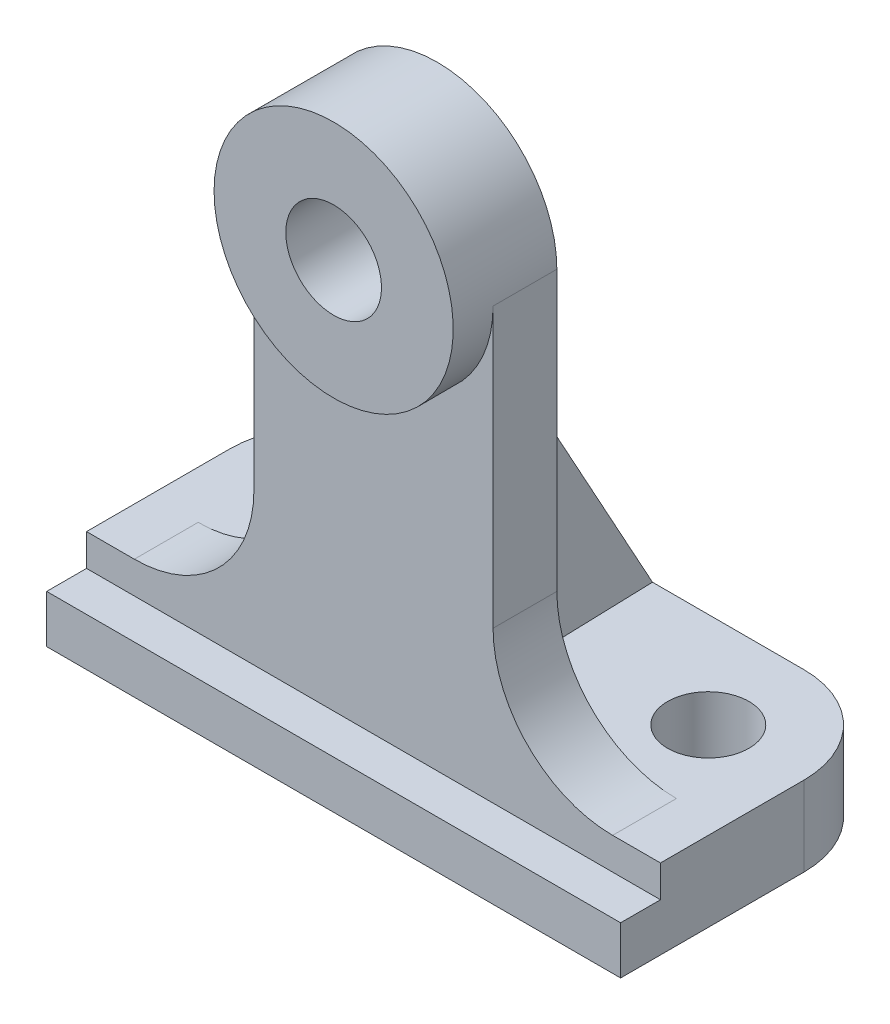
ISO-10303-21;
HEADER;
FILE_DESCRIPTION(('STEP AP214'),'2;1');
FILE_NAME('part.step','',(''),(''),'','','');
FILE_SCHEMA(('AUTOMOTIVE_DESIGN { 1 0 10303 214 1 1 1 1 }'));
ENDSEC;
DATA;
#1=APPLICATION_CONTEXT('core data for automotive mechanical design processes');
#2=APPLICATION_PROTOCOL_DEFINITION('international standard','automotive_design',2000,#1);
#3=PRODUCT_CONTEXT('',#1,'mechanical');
#4=PRODUCT('Part','Part','',(#3));
#5=PRODUCT_RELATED_PRODUCT_CATEGORY('part','',(#4));
#6=PRODUCT_DEFINITION_FORMATION('','',#4);
#7=PRODUCT_DEFINITION_CONTEXT('part definition',#1,'design');
#8=PRODUCT_DEFINITION('design','',#6,#7);
#9=PRODUCT_DEFINITION_SHAPE('','',#8);
#10=(LENGTH_UNIT() NAMED_UNIT(*) SI_UNIT(.MILLI.,.METRE.));
#11=(NAMED_UNIT(*) PLANE_ANGLE_UNIT() SI_UNIT($,.RADIAN.));
#12=(NAMED_UNIT(*) SI_UNIT($,.STERADIAN.) SOLID_ANGLE_UNIT());
#13=UNCERTAINTY_MEASURE_WITH_UNIT(LENGTH_MEASURE(1.E-05),#10,'distance_accuracy_value','');
#14=(GEOMETRIC_REPRESENTATION_CONTEXT(3) GLOBAL_UNCERTAINTY_ASSIGNED_CONTEXT((#13)) GLOBAL_UNIT_ASSIGNED_CONTEXT((#10,
#11,#12)) REPRESENTATION_CONTEXT('',''));
#15=CARTESIAN_POINT('',(0.,0.,0.));
#16=DIRECTION('',(0.,0.,1.));
#17=DIRECTION('',(1.,0.,0.));
#18=AXIS2_PLACEMENT_3D('',#15,#16,#17);
#19=CARTESIAN_POINT('',(-36.,5.,35.));
#20=DIRECTION('',(0.,-1.,0.));
#21=DIRECTION('',(0.,0.,-1.));
#22=AXIS2_PLACEMENT_3D('',#19,#20,#21);
#23=PLANE('',#22);
#24=CARTESIAN_POINT('',(-24.,5.,12.));
#25=DIRECTION('',(0.,1.,0.));
#26=DIRECTION('',(0.,0.,1.));
#27=AXIS2_PLACEMENT_3D('',#24,#25,#26);
#28=CIRCLE('',#27,5.1);
#29=CARTESIAN_POINT('',(-24.,5.,17.1));
#30=VERTEX_POINT('',#29);
#31=EDGE_CURVE('E366',#30,#30,#28,.T.);
#32=ORIENTED_EDGE('',*,*,#31,.F.);
#33=EDGE_LOOP('',(#32));
#34=FACE_BOUND('',#33,.T.);
#35=DIRECTION('',(-1.,0.,0.));
#36=VECTOR('',#35,1.);
#37=CARTESIAN_POINT('',(-36.,5.,0.));
#38=LINE('',#37,#36);
#39=CARTESIAN_POINT('',(-5.,5.,0.));
#40=VERTEX_POINT('',#39);
#41=CARTESIAN_POINT('',(-24.,5.,0.));
#42=VERTEX_POINT('',#41);
#43=EDGE_CURVE('E180',#40,#42,#38,.T.);
#44=ORIENTED_EDGE('',*,*,#43,.T.);
#45=CARTESIAN_POINT('',(-24.,5.,12.));
#46=DIRECTION('',(0.,-1.,0.));
#47=DIRECTION('',(0.,0.,-1.));
#48=AXIS2_PLACEMENT_3D('',#45,#46,#47);
#49=CIRCLE('',#48,12.);
#50=CARTESIAN_POINT('',(-36.,5.,12.));
#51=VERTEX_POINT('',#50);
#52=EDGE_CURVE('E242',#42,#51,#49,.F.);
#53=ORIENTED_EDGE('',*,*,#52,.T.);
#54=DIRECTION('',(0.,0.,-1.));
#55=VECTOR('',#54,1.);
#56=CARTESIAN_POINT('',(-36.,5.,35.));
#57=LINE('',#56,#55);
#58=CARTESIAN_POINT('',(-36.,5.,30.));
#59=VERTEX_POINT('',#58);
#60=EDGE_CURVE('E209',#59,#51,#57,.T.);
#61=ORIENTED_EDGE('',*,*,#60,.F.);
#62=DIRECTION('',(-1.,0.,0.));
#63=VECTOR('',#62,1.);
#64=CARTESIAN_POINT('',(36.,5.,30.));
#65=LINE('',#64,#63);
#66=CARTESIAN_POINT('',(-30.,5.,30.));
#67=VERTEX_POINT('',#66);
#68=EDGE_CURVE('E257',#67,#59,#65,.T.);
#69=ORIENTED_EDGE('',*,*,#68,.F.);
#70=DIRECTION('',(0.,0.,-1.));
#71=VECTOR('',#70,1.);
#72=CARTESIAN_POINT('',(-30.,5.,35.));
#73=LINE('',#72,#71);
#74=CARTESIAN_POINT('',(-30.,5.,22.));
#75=VERTEX_POINT('',#74);
#76=EDGE_CURVE('E217',#67,#75,#73,.T.);
#77=ORIENTED_EDGE('',*,*,#76,.T.);
#78=DIRECTION('',(1.,0.,0.));
#79=VECTOR('',#78,1.);
#80=CARTESIAN_POINT('',(-15.,5.,22.));
#81=LINE('',#80,#79);
#82=CARTESIAN_POINT('',(-5.67315894298179,5.,22.));
#83=VERTEX_POINT('',#82);
#84=EDGE_CURVE('E183',#75,#83,#81,.T.);
#85=ORIENTED_EDGE('',*,*,#84,.T.);
#86=DIRECTION('',(-0.0305838201349596,0.,0.999532205557156));
#87=VECTOR('',#86,1.);
#88=CARTESIAN_POINT('',(-6.09892943346056,5.,35.914916957118));
#89=LINE('',#88,#87);
#90=EDGE_CURVE('E172',#40,#83,#89,.T.);
#91=ORIENTED_EDGE('',*,*,#90,.F.);
#92=EDGE_LOOP('',(#44,#53,#61,#69,#77,#85,#91));
#93=FACE_BOUND('',#92,.T.);
#94=ADVANCED_FACE('F39',(#34,#93),#23,.F.);
#95=CARTESIAN_POINT('',(24.,5.,12.));
#96=DIRECTION('',(0.,1.,0.));
#97=DIRECTION('',(0.,0.,1.));
#98=AXIS2_PLACEMENT_3D('',#95,#96,#97);
#99=CIRCLE('',#98,5.1);
#100=CARTESIAN_POINT('',(24.,5.,17.1));
#101=VERTEX_POINT('',#100);
#102=EDGE_CURVE('E360',#101,#101,#99,.T.);
#103=ORIENTED_EDGE('',*,*,#102,.F.);
#104=EDGE_LOOP('',(#103));
#105=FACE_BOUND('',#104,.T.);
#106=DIRECTION('',(0.,0.,-1.));
#107=VECTOR('',#106,1.);
#108=CARTESIAN_POINT('',(36.,5.,35.));
#109=LINE('',#108,#107);
#110=CARTESIAN_POINT('',(36.,5.,30.));
#111=VERTEX_POINT('',#110);
#112=CARTESIAN_POINT('',(36.,5.,12.));
#113=VERTEX_POINT('',#112);
#114=EDGE_CURVE('E212',#111,#113,#109,.T.);
#115=ORIENTED_EDGE('',*,*,#114,.T.);
#116=CARTESIAN_POINT('',(24.,5.,12.));
#117=DIRECTION('',(0.,-1.,0.));
#118=DIRECTION('',(0.,0.,-1.));
#119=AXIS2_PLACEMENT_3D('',#116,#117,#118);
#120=CIRCLE('',#119,12.);
#121=CARTESIAN_POINT('',(24.,5.,0.));
#122=VERTEX_POINT('',#121);
#123=EDGE_CURVE('E12',#113,#122,#120,.F.);
#124=ORIENTED_EDGE('',*,*,#123,.T.);
#125=CARTESIAN_POINT('',(5.,4.99999999999999,0.));
#126=VERTEX_POINT('',#125);
#127=EDGE_CURVE('E189',#122,#126,#38,.T.);
#128=ORIENTED_EDGE('',*,*,#127,.T.);
#129=DIRECTION('',(0.0305838201349596,0.,0.999532205557156));
#130=VECTOR('',#129,1.);
#131=CARTESIAN_POINT('',(6.03158278956913,5.,33.7139120071601));
#132=LINE('',#131,#130);
#133=CARTESIAN_POINT('',(5.67315894298178,5.,22.));
#134=VERTEX_POINT('',#133);
#135=EDGE_CURVE('E355',#126,#134,#132,.T.);
#136=ORIENTED_EDGE('',*,*,#135,.T.);
#137=CARTESIAN_POINT('',(30.,5.,22.));
#138=VERTEX_POINT('',#137);
#139=EDGE_CURVE('E330',#134,#138,#81,.T.);
#140=ORIENTED_EDGE('',*,*,#139,.T.);
#141=DIRECTION('',(0.,0.,1.));
#142=VECTOR('',#141,1.);
#143=CARTESIAN_POINT('',(30.,5.,35.));
#144=LINE('',#143,#142);
#145=CARTESIAN_POINT('',(30.,5.,30.));
#146=VERTEX_POINT('',#145);
#147=EDGE_CURVE('E214',#138,#146,#144,.T.);
#148=ORIENTED_EDGE('',*,*,#147,.T.);
#149=EDGE_CURVE('E253',#111,#146,#65,.T.);
#150=ORIENTED_EDGE('',*,*,#149,.F.);
#151=EDGE_LOOP('',(#115,#124,#128,#136,#140,#148,#150));
#152=FACE_BOUND('',#151,.T.);
#153=ADVANCED_FACE('F251',(#105,#152),#23,.F.);
#154=CARTESIAN_POINT('',(36.,5.,35.));
#155=DIRECTION('',(-1.,0.,0.));
#156=DIRECTION('',(0.,0.,1.));
#157=AXIS2_PLACEMENT_3D('',#154,#155,#156);
#158=PLANE('',#157);
#159=DIRECTION('',(0.,0.,-1.));
#160=VECTOR('',#159,1.);
#161=CARTESIAN_POINT('',(36.,-5.,35.));
#162=LINE('',#161,#160);
#163=CARTESIAN_POINT('',(36.,-5.,35.));
#164=VERTEX_POINT('',#163);
#165=CARTESIAN_POINT('',(36.,-5.,12.));
#166=VERTEX_POINT('',#165);
#167=EDGE_CURVE('E203',#164,#166,#162,.T.);
#168=ORIENTED_EDGE('',*,*,#167,.T.);
#169=DIRECTION('',(0.,1.,0.));
#170=VECTOR('',#169,1.);
#171=CARTESIAN_POINT('',(36.,5.,12.));
#172=LINE('',#171,#170);
#173=EDGE_CURVE('E47',#166,#113,#172,.T.);
#174=ORIENTED_EDGE('',*,*,#173,.T.);
#175=ORIENTED_EDGE('',*,*,#114,.F.);
#176=DIRECTION('',(0.,1.,0.));
#177=VECTOR('',#176,1.);
#178=CARTESIAN_POINT('',(36.,0.999999999999999,30.));
#179=LINE('',#178,#177);
#180=CARTESIAN_POINT('',(36.,0.999999999999999,30.));
#181=VERTEX_POINT('',#180);
#182=EDGE_CURVE('E268',#181,#111,#179,.T.);
#183=ORIENTED_EDGE('',*,*,#182,.F.);
#184=DIRECTION('',(0.,0.,1.));
#185=VECTOR('',#184,1.);
#186=CARTESIAN_POINT('',(36.,0.999999999999999,30.));
#187=LINE('',#186,#185);
#188=CARTESIAN_POINT('',(36.,0.999999999999999,35.));
#189=VERTEX_POINT('',#188);
#190=EDGE_CURVE('E190',#181,#189,#187,.T.);
#191=ORIENTED_EDGE('',*,*,#190,.T.);
#192=DIRECTION('',(0.,1.,0.));
#193=VECTOR('',#192,1.);
#194=CARTESIAN_POINT('',(36.,5.,35.));
#195=LINE('',#194,#193);
#196=EDGE_CURVE('E202',#164,#189,#195,.T.);
#197=ORIENTED_EDGE('',*,*,#196,.F.);
#198=EDGE_LOOP('',(#168,#174,#175,#183,#191,#197));
#199=FACE_BOUND('',#198,.T.);
#200=ADVANCED_FACE('F245',(#199),#158,.F.);
#201=CARTESIAN_POINT('',(-36.,5.,35.));
#202=DIRECTION('',(1.,0.,0.));
#203=DIRECTION('',(0.,0.,-1.));
#204=AXIS2_PLACEMENT_3D('',#201,#202,#203);
#205=PLANE('',#204);
#206=ORIENTED_EDGE('',*,*,#60,.T.);
#207=DIRECTION('',(0.,-1.,0.));
#208=VECTOR('',#207,1.);
#209=CARTESIAN_POINT('',(-36.,5.,12.));
#210=LINE('',#209,#208);
#211=CARTESIAN_POINT('',(-36.,-5.,12.));
#212=VERTEX_POINT('',#211);
#213=EDGE_CURVE('E232',#51,#212,#210,.T.);
#214=ORIENTED_EDGE('',*,*,#213,.T.);
#215=DIRECTION('',(0.,0.,-1.));
#216=VECTOR('',#215,1.);
#217=CARTESIAN_POINT('',(-36.,-5.,35.));
#218=LINE('',#217,#216);
#219=CARTESIAN_POINT('',(-36.,-5.,35.));
#220=VERTEX_POINT('',#219);
#221=EDGE_CURVE('E206',#220,#212,#218,.T.);
#222=ORIENTED_EDGE('',*,*,#221,.F.);
#223=DIRECTION('',(0.,-1.,0.));
#224=VECTOR('',#223,1.);
#225=CARTESIAN_POINT('',(-36.,5.,35.));
#226=LINE('',#225,#224);
#227=CARTESIAN_POINT('',(-36.,0.999999999999999,35.));
#228=VERTEX_POINT('',#227);
#229=EDGE_CURVE('E274',#228,#220,#226,.T.);
#230=ORIENTED_EDGE('',*,*,#229,.F.);
#231=DIRECTION('',(0.,0.,1.));
#232=VECTOR('',#231,1.);
#233=CARTESIAN_POINT('',(-36.,0.999999999999999,30.));
#234=LINE('',#233,#232);
#235=CARTESIAN_POINT('',(-36.,0.999999999999999,30.));
#236=VERTEX_POINT('',#235);
#237=EDGE_CURVE('E194',#236,#228,#234,.T.);
#238=ORIENTED_EDGE('',*,*,#237,.F.);
#239=DIRECTION('',(0.,-1.,0.));
#240=VECTOR('',#239,1.);
#241=CARTESIAN_POINT('',(-36.,5.,30.));
#242=LINE('',#241,#240);
#243=EDGE_CURVE('E256',#59,#236,#242,.T.);
#244=ORIENTED_EDGE('',*,*,#243,.F.);
#245=EDGE_LOOP('',(#206,#214,#222,#230,#238,#244));
#246=FACE_BOUND('',#245,.T.);
#247=ADVANCED_FACE('F288',(#246),#205,.F.);
#248=CARTESIAN_POINT('',(-36.,-5.,35.));
#249=DIRECTION('',(0.,1.,0.));
#250=DIRECTION('',(0.,0.,1.));
#251=AXIS2_PLACEMENT_3D('',#248,#249,#250);
#252=PLANE('',#251);
#253=CARTESIAN_POINT('',(-24.,-5.,12.));
#254=DIRECTION('',(0.,1.,0.));
#255=DIRECTION('',(0.,0.,1.));
#256=AXIS2_PLACEMENT_3D('',#253,#254,#255);
#257=CIRCLE('',#256,5.1);
#258=CARTESIAN_POINT('',(-24.,-5.,17.1));
#259=VERTEX_POINT('',#258);
#260=EDGE_CURVE('E175',#259,#259,#257,.T.);
#261=ORIENTED_EDGE('',*,*,#260,.T.);
#262=EDGE_LOOP('',(#261));
#263=FACE_BOUND('',#262,.T.);
#264=CARTESIAN_POINT('',(24.,-5.,12.));
#265=DIRECTION('',(0.,1.,0.));
#266=DIRECTION('',(0.,0.,1.));
#267=AXIS2_PLACEMENT_3D('',#264,#265,#266);
#268=CIRCLE('',#267,5.1);
#269=CARTESIAN_POINT('',(24.,-5.,17.1));
#270=VERTEX_POINT('',#269);
#271=EDGE_CURVE('E363',#270,#270,#268,.T.);
#272=ORIENTED_EDGE('',*,*,#271,.T.);
#273=EDGE_LOOP('',(#272));
#274=FACE_BOUND('',#273,.T.);
#275=ORIENTED_EDGE('',*,*,#221,.T.);
#276=CARTESIAN_POINT('',(-24.,-5.,12.));
#277=DIRECTION('',(0.,1.,0.));
#278=DIRECTION('',(0.,0.,1.));
#279=AXIS2_PLACEMENT_3D('',#276,#277,#278);
#280=CIRCLE('',#279,12.);
#281=CARTESIAN_POINT('',(-24.,-5.,0.));
#282=VERTEX_POINT('',#281);
#283=EDGE_CURVE('E237',#212,#282,#280,.F.);
#284=ORIENTED_EDGE('',*,*,#283,.T.);
#285=DIRECTION('',(1.,0.,0.));
#286=VECTOR('',#285,1.);
#287=CARTESIAN_POINT('',(-36.,-5.,0.));
#288=LINE('',#287,#286);
#289=CARTESIAN_POINT('',(24.,-5.,0.));
#290=VERTEX_POINT('',#289);
#291=EDGE_CURVE('E192',#282,#290,#288,.T.);
#292=ORIENTED_EDGE('',*,*,#291,.T.);
#293=CARTESIAN_POINT('',(24.,-5.,12.));
#294=DIRECTION('',(0.,1.,0.));
#295=DIRECTION('',(0.,0.,1.));
#296=AXIS2_PLACEMENT_3D('',#293,#294,#295);
#297=CIRCLE('',#296,12.);
#298=EDGE_CURVE('E235',#290,#166,#297,.F.);
#299=ORIENTED_EDGE('',*,*,#298,.T.);
#300=ORIENTED_EDGE('',*,*,#167,.F.);
#301=DIRECTION('',(1.,0.,0.));
#302=VECTOR('',#301,1.);
#303=CARTESIAN_POINT('',(-36.,-5.,35.));
#304=LINE('',#303,#302);
#305=EDGE_CURVE('E198',#220,#164,#304,.T.);
#306=ORIENTED_EDGE('',*,*,#305,.F.);
#307=EDGE_LOOP('',(#275,#284,#292,#299,#300,#306));
#308=FACE_BOUND('',#307,.T.);
#309=ADVANCED_FACE('F282',(#263,#274,#308),#252,.F.);
#310=CARTESIAN_POINT('',(0.,0.,35.));
#311=DIRECTION('',(0.,0.,1.));
#312=DIRECTION('',(1.,0.,0.));
#313=AXIS2_PLACEMENT_3D('',#310,#311,#312);
#314=PLANE('',#313);
#315=ORIENTED_EDGE('',*,*,#196,.T.);
#316=DIRECTION('',(1.,0.,0.));
#317=VECTOR('',#316,1.);
#318=CARTESIAN_POINT('',(-36.,0.999999999999999,35.));
#319=LINE('',#318,#317);
#320=EDGE_CURVE('E262',#228,#189,#319,.T.);
#321=ORIENTED_EDGE('',*,*,#320,.F.);
#322=ORIENTED_EDGE('',*,*,#229,.T.);
#323=ORIENTED_EDGE('',*,*,#305,.T.);
#324=EDGE_LOOP('',(#315,#321,#322,#323));
#325=FACE_BOUND('',#324,.T.);
#326=ADVANCED_FACE('F280',(#325),#314,.T.);
#327=CARTESIAN_POINT('',(0.,0.,0.));
#328=DIRECTION('',(0.,0.,1.));
#329=DIRECTION('',(1.,0.,0.));
#330=AXIS2_PLACEMENT_3D('',#327,#328,#329);
#331=PLANE('',#330);
#332=ORIENTED_EDGE('',*,*,#291,.F.);
#333=DIRECTION('',(0.,-1.,0.));
#334=VECTOR('',#333,1.);
#335=CARTESIAN_POINT('',(-24.,0.,0.));
#336=LINE('',#335,#334);
#337=EDGE_CURVE('E188',#282,#42,#336,.F.);
#338=ORIENTED_EDGE('',*,*,#337,.T.);
#339=ORIENTED_EDGE('',*,*,#43,.F.);
#340=DIRECTION('',(-1.,0.,0.));
#341=VECTOR('',#340,1.);
#342=CARTESIAN_POINT('',(0.,5.,0.));
#343=LINE('',#342,#341);
#344=EDGE_CURVE('E157',#126,#40,#343,.T.);
#345=ORIENTED_EDGE('',*,*,#344,.F.);
#346=ORIENTED_EDGE('',*,*,#127,.F.);
#347=DIRECTION('',(0.,1.,0.));
#348=VECTOR('',#347,1.);
#349=CARTESIAN_POINT('',(24.,0.,0.));
#350=LINE('',#349,#348);
#351=EDGE_CURVE('E239',#122,#290,#350,.F.);
#352=ORIENTED_EDGE('',*,*,#351,.T.);
#353=EDGE_LOOP('',(#332,#338,#339,#345,#346,#352));
#354=FACE_BOUND('',#353,.T.);
#355=ADVANCED_FACE('F186',(#354),#331,.F.);
#356=CARTESIAN_POINT('',(-36.,0.999999999999999,30.));
#357=DIRECTION('',(0.,-1.,0.));
#358=DIRECTION('',(0.,0.,-1.));
#359=AXIS2_PLACEMENT_3D('',#356,#357,#358);
#360=PLANE('',#359);
#361=ORIENTED_EDGE('',*,*,#190,.F.);
#362=DIRECTION('',(1.,0.,0.));
#363=VECTOR('',#362,1.);
#364=CARTESIAN_POINT('',(-36.,0.999999999999999,30.));
#365=LINE('',#364,#363);
#366=EDGE_CURVE('E260',#236,#181,#365,.T.);
#367=ORIENTED_EDGE('',*,*,#366,.F.);
#368=ORIENTED_EDGE('',*,*,#237,.T.);
#369=ORIENTED_EDGE('',*,*,#320,.T.);
#370=EDGE_LOOP('',(#361,#367,#368,#369));
#371=FACE_BOUND('',#370,.T.);
#372=ADVANCED_FACE('F285',(#371),#360,.F.);
#373=CARTESIAN_POINT('',(0.,0.,30.));
#374=DIRECTION('',(0.,0.,1.));
#375=DIRECTION('',(1.,0.,0.));
#376=AXIS2_PLACEMENT_3D('',#373,#374,#375);
#377=PLANE('',#376);
#378=DIRECTION('',(0.,-1.,0.));
#379=VECTOR('',#378,1.);
#380=CARTESIAN_POINT('',(15.,55.,30.));
#381=LINE('',#380,#379);
#382=CARTESIAN_POINT('',(15.,55.,30.));
#383=VERTEX_POINT('',#382);
#384=CARTESIAN_POINT('',(15.,20.,30.));
#385=VERTEX_POINT('',#384);
#386=EDGE_CURVE('E320',#383,#385,#381,.T.);
#387=ORIENTED_EDGE('',*,*,#386,.F.);
#388=CARTESIAN_POINT('',(0.,55.,30.));
#389=DIRECTION('',(0.,0.,1.));
#390=DIRECTION('',(1.,0.,0.));
#391=AXIS2_PLACEMENT_3D('',#388,#389,#390);
#392=CIRCLE('',#391,15.);
#393=CARTESIAN_POINT('',(-15.,55.,30.));
#394=VERTEX_POINT('',#393);
#395=EDGE_CURVE('E341',#394,#383,#392,.T.);
#396=ORIENTED_EDGE('',*,*,#395,.F.);
#397=DIRECTION('',(0.,-1.,0.));
#398=VECTOR('',#397,1.);
#399=CARTESIAN_POINT('',(-15.,55.,30.));
#400=LINE('',#399,#398);
#401=CARTESIAN_POINT('',(-15.,20.,30.));
#402=VERTEX_POINT('',#401);
#403=EDGE_CURVE('E270',#394,#402,#400,.T.);
#404=ORIENTED_EDGE('',*,*,#403,.T.);
#405=CARTESIAN_POINT('',(-30.,20.,30.));
#406=DIRECTION('',(0.,0.,1.));
#407=DIRECTION('',(1.,0.,0.));
#408=AXIS2_PLACEMENT_3D('',#405,#406,#407);
#409=CIRCLE('',#408,15.);
#410=EDGE_CURVE('E225',#402,#67,#409,.F.);
#411=ORIENTED_EDGE('',*,*,#410,.T.);
#412=ORIENTED_EDGE('',*,*,#68,.T.);
#413=ORIENTED_EDGE('',*,*,#243,.T.);
#414=ORIENTED_EDGE('',*,*,#366,.T.);
#415=ORIENTED_EDGE('',*,*,#182,.T.);
#416=ORIENTED_EDGE('',*,*,#149,.T.);
#417=CARTESIAN_POINT('',(30.,20.,30.));
#418=DIRECTION('',(0.,0.,1.));
#419=DIRECTION('',(1.,0.,0.));
#420=AXIS2_PLACEMENT_3D('',#417,#418,#419);
#421=CIRCLE('',#420,15.);
#422=EDGE_CURVE('E227',#146,#385,#421,.F.);
#423=ORIENTED_EDGE('',*,*,#422,.T.);
#424=EDGE_LOOP('',(#387,#396,#404,#411,#412,#413,#414,#415,#416,#423));
#425=FACE_BOUND('',#424,.T.);
#426=ADVANCED_FACE('F296',(#425),#377,.T.);
#427=CARTESIAN_POINT('',(-15.,55.,30.));
#428=DIRECTION('',(-1.,0.,0.));
#429=DIRECTION('',(0.,0.,1.));
#430=AXIS2_PLACEMENT_3D('',#427,#428,#429);
#431=PLANE('',#430);
#432=DIRECTION('',(0.,-1.,0.));
#433=VECTOR('',#432,1.);
#434=CARTESIAN_POINT('',(-15.,55.,22.));
#435=LINE('',#434,#433);
#436=CARTESIAN_POINT('',(-15.,55.,22.));
#437=VERTEX_POINT('',#436);
#438=CARTESIAN_POINT('',(-15.,20.,22.));
#439=VERTEX_POINT('',#438);
#440=EDGE_CURVE('E264',#437,#439,#435,.T.);
#441=ORIENTED_EDGE('',*,*,#440,.T.);
#442=DIRECTION('',(0.,0.,-1.));
#443=VECTOR('',#442,1.);
#444=CARTESIAN_POINT('',(-15.,20.,30.));
#445=LINE('',#444,#443);
#446=EDGE_CURVE('E219',#439,#402,#445,.F.);
#447=ORIENTED_EDGE('',*,*,#446,.T.);
#448=ORIENTED_EDGE('',*,*,#403,.F.);
#449=DIRECTION('',(0.,0.,-1.));
#450=VECTOR('',#449,1.);
#451=CARTESIAN_POINT('',(-15.,55.,30.));
#452=LINE('',#451,#450);
#453=EDGE_CURVE('E315',#394,#437,#452,.T.);
#454=ORIENTED_EDGE('',*,*,#453,.T.);
#455=EDGE_LOOP('',(#441,#447,#448,#454));
#456=FACE_BOUND('',#455,.T.);
#457=ADVANCED_FACE('F312',(#456),#431,.T.);
#458=CARTESIAN_POINT('',(15.,55.,22.));
#459=DIRECTION('',(1.,0.,0.));
#460=DIRECTION('',(0.,0.,-1.));
#461=AXIS2_PLACEMENT_3D('',#458,#459,#460);
#462=PLANE('',#461);
#463=ORIENTED_EDGE('',*,*,#386,.T.);
#464=DIRECTION('',(0.,0.,1.));
#465=VECTOR('',#464,1.);
#466=CARTESIAN_POINT('',(15.,20.,22.));
#467=LINE('',#466,#465);
#468=CARTESIAN_POINT('',(15.,20.,22.));
#469=VERTEX_POINT('',#468);
#470=EDGE_CURVE('E221',#385,#469,#467,.F.);
#471=ORIENTED_EDGE('',*,*,#470,.T.);
#472=DIRECTION('',(0.,-1.,0.));
#473=VECTOR('',#472,1.);
#474=CARTESIAN_POINT('',(15.,55.,22.));
#475=LINE('',#474,#473);
#476=CARTESIAN_POINT('',(15.,55.,22.));
#477=VERTEX_POINT('',#476);
#478=EDGE_CURVE('E317',#477,#469,#475,.T.);
#479=ORIENTED_EDGE('',*,*,#478,.F.);
#480=DIRECTION('',(0.,0.,1.));
#481=VECTOR('',#480,1.);
#482=CARTESIAN_POINT('',(15.,55.,22.));
#483=LINE('',#482,#481);
#484=EDGE_CURVE('E318',#477,#383,#483,.T.);
#485=ORIENTED_EDGE('',*,*,#484,.T.);
#486=EDGE_LOOP('',(#463,#471,#479,#485));
#487=FACE_BOUND('',#486,.T.);
#488=ADVANCED_FACE('F333',(#487),#462,.T.);
#489=CARTESIAN_POINT('',(-15.,55.,22.));
#490=DIRECTION('',(0.,0.,-1.));
#491=DIRECTION('',(-1.,0.,0.));
#492=AXIS2_PLACEMENT_3D('',#489,#490,#491);
#493=PLANE('',#492);
#494=DIRECTION('',(0.0168265909772028,-0.999858422896005,0.));
#495=VECTOR('',#494,1.);
#496=CARTESIAN_POINT('',(4.82609522954989,55.3336528327045,22.));
#497=LINE('',#496,#495);
#498=CARTESIAN_POINT('',(5.,45.,22.));
#499=VERTEX_POINT('',#498);
#500=EDGE_CURVE('E353',#499,#134,#497,.T.);
#501=ORIENTED_EDGE('',*,*,#500,.F.);
#502=DIRECTION('',(1.,0.,0.));
#503=VECTOR('',#502,1.);
#504=CARTESIAN_POINT('',(-15.,45.,22.));
#505=LINE('',#504,#503);
#506=CARTESIAN_POINT('',(-5.,45.,22.));
#507=VERTEX_POINT('',#506);
#508=EDGE_CURVE('E167',#507,#499,#505,.T.);
#509=ORIENTED_EDGE('',*,*,#508,.F.);
#510=DIRECTION('',(-0.0168265909772028,-0.999858422896005,0.));
#511=VECTOR('',#510,1.);
#512=CARTESIAN_POINT('',(-4.83458925446732,54.828926571189,22.));
#513=LINE('',#512,#511);
#514=EDGE_CURVE('E174',#507,#83,#513,.T.);
#515=ORIENTED_EDGE('',*,*,#514,.T.);
#516=ORIENTED_EDGE('',*,*,#84,.F.);
#517=CARTESIAN_POINT('',(-30.,20.,22.));
#518=DIRECTION('',(0.,0.,-1.));
#519=DIRECTION('',(-1.,0.,0.));
#520=AXIS2_PLACEMENT_3D('',#517,#518,#519);
#521=CIRCLE('',#520,15.);
#522=EDGE_CURVE('E223',#75,#439,#521,.F.);
#523=ORIENTED_EDGE('',*,*,#522,.T.);
#524=ORIENTED_EDGE('',*,*,#440,.F.);
#525=CARTESIAN_POINT('',(0.,55.,22.));
#526=DIRECTION('',(0.,0.,-1.));
#527=DIRECTION('',(-1.,0.,0.));
#528=AXIS2_PLACEMENT_3D('',#525,#526,#527);
#529=CIRCLE('',#528,15.);
#530=EDGE_CURVE('E338',#437,#477,#529,.T.);
#531=ORIENTED_EDGE('',*,*,#530,.T.);
#532=ORIENTED_EDGE('',*,*,#478,.T.);
#533=CARTESIAN_POINT('',(30.,20.,22.));
#534=DIRECTION('',(0.,0.,-1.));
#535=DIRECTION('',(-1.,0.,0.));
#536=AXIS2_PLACEMENT_3D('',#533,#534,#535);
#537=CIRCLE('',#536,15.);
#538=EDGE_CURVE('E229',#469,#138,#537,.F.);
#539=ORIENTED_EDGE('',*,*,#538,.T.);
#540=ORIENTED_EDGE('',*,*,#139,.F.);
#541=EDGE_LOOP('',(#501,#509,#515,#516,#523,#524,#531,#532,#539,#540));
#542=FACE_BOUND('',#541,.T.);
#543=CARTESIAN_POINT('',(0.,55.,22.));
#544=DIRECTION('',(0.,0.,-1.));
#545=DIRECTION('',(-1.,0.,0.));
#546=AXIS2_PLACEMENT_3D('',#543,#544,#545);
#547=CIRCLE('',#546,6.);
#548=CARTESIAN_POINT('',(-6.,55.,22.));
#549=VERTEX_POINT('',#548);
#550=EDGE_CURVE('E166',#549,#549,#547,.T.);
#551=ORIENTED_EDGE('',*,*,#550,.F.);
#552=EDGE_LOOP('',(#551));
#553=FACE_BOUND('',#552,.T.);
#554=ADVANCED_FACE('F307',(#542,#553),#493,.T.);
#555=CARTESIAN_POINT('',(0.,55.,35.));
#556=DIRECTION('',(0.,0.,-1.));
#557=DIRECTION('',(-1.,0.,0.));
#558=AXIS2_PLACEMENT_3D('',#555,#556,#557);
#559=CYLINDRICAL_SURFACE('',#558,15.);
#560=CARTESIAN_POINT('',(0.,55.,35.));
#561=DIRECTION('',(0.,0.,-1.));
#562=DIRECTION('',(-1.,0.,0.));
#563=AXIS2_PLACEMENT_3D('',#560,#561,#562);
#564=CIRCLE('',#563,15.);
#565=CARTESIAN_POINT('',(-15.,55.,35.));
#566=VERTEX_POINT('',#565);
#567=EDGE_CURVE('E342',#566,#566,#564,.T.);
#568=ORIENTED_EDGE('',*,*,#567,.T.);
#569=EDGE_LOOP('',(#568));
#570=FACE_BOUND('',#569,.T.);
#571=ORIENTED_EDGE('',*,*,#395,.T.);
#572=ORIENTED_EDGE('',*,*,#484,.F.);
#573=ORIENTED_EDGE('',*,*,#530,.F.);
#574=ORIENTED_EDGE('',*,*,#453,.F.);
#575=EDGE_LOOP('',(#571,#572,#573,#574));
#576=FACE_BOUND('',#575,.T.);
#577=ADVANCED_FACE('F340',(#570,#576),#559,.T.);
#578=CARTESIAN_POINT('',(0.,55.,35.));
#579=DIRECTION('',(0.,0.,-1.));
#580=DIRECTION('',(-1.,0.,0.));
#581=AXIS2_PLACEMENT_3D('',#578,#579,#580);
#582=CYLINDRICAL_SURFACE('',#581,6.);
#583=CARTESIAN_POINT('',(0.,55.,35.));
#584=DIRECTION('',(0.,0.,-1.));
#585=DIRECTION('',(-1.,0.,0.));
#586=AXIS2_PLACEMENT_3D('',#583,#584,#585);
#587=CIRCLE('',#586,6.);
#588=CARTESIAN_POINT('',(-6.00000000000001,55.,35.));
#589=VERTEX_POINT('',#588);
#590=EDGE_CURVE('E346',#589,#589,#587,.T.);
#591=ORIENTED_EDGE('',*,*,#590,.F.);
#592=EDGE_LOOP('',(#591));
#593=FACE_BOUND('',#592,.T.);
#594=ORIENTED_EDGE('',*,*,#550,.T.);
#595=EDGE_LOOP('',(#594));
#596=FACE_BOUND('',#595,.T.);
#597=ADVANCED_FACE('F411',(#593,#596),#582,.F.);
#598=CARTESIAN_POINT('',(0.,55.,35.));
#599=DIRECTION('',(0.,0.,-1.));
#600=DIRECTION('',(-1.,0.,0.));
#601=AXIS2_PLACEMENT_3D('',#598,#599,#600);
#602=PLANE('',#601);
#603=ORIENTED_EDGE('',*,*,#590,.T.);
#604=EDGE_LOOP('',(#603));
#605=FACE_BOUND('',#604,.T.);
#606=ORIENTED_EDGE('',*,*,#567,.F.);
#607=EDGE_LOOP('',(#606));
#608=FACE_BOUND('',#607,.T.);
#609=ADVANCED_FACE('F395',(#605,#608),#602,.F.);
#610=CARTESIAN_POINT('',(-30.,20.,35.));
#611=DIRECTION('',(0.,0.,-1.));
#612=DIRECTION('',(-1.,0.,0.));
#613=AXIS2_PLACEMENT_3D('',#610,#611,#612);
#614=CYLINDRICAL_SURFACE('',#613,15.);
#615=ORIENTED_EDGE('',*,*,#410,.F.);
#616=ORIENTED_EDGE('',*,*,#446,.F.);
#617=ORIENTED_EDGE('',*,*,#522,.F.);
#618=ORIENTED_EDGE('',*,*,#76,.F.);
#619=EDGE_LOOP('',(#615,#616,#617,#618));
#620=FACE_BOUND('',#619,.T.);
#621=ADVANCED_FACE('F302',(#620),#614,.F.);
#622=CARTESIAN_POINT('',(30.,20.,35.));
#623=DIRECTION('',(0.,0.,1.));
#624=DIRECTION('',(1.,0.,0.));
#625=AXIS2_PLACEMENT_3D('',#622,#623,#624);
#626=CYLINDRICAL_SURFACE('',#625,15.);
#627=ORIENTED_EDGE('',*,*,#538,.F.);
#628=ORIENTED_EDGE('',*,*,#470,.F.);
#629=ORIENTED_EDGE('',*,*,#422,.F.);
#630=ORIENTED_EDGE('',*,*,#147,.F.);
#631=EDGE_LOOP('',(#627,#628,#629,#630));
#632=FACE_BOUND('',#631,.T.);
#633=ADVANCED_FACE('F336',(#632),#626,.F.);
#634=CARTESIAN_POINT('',(0.,5.,0.));
#635=DIRECTION('',(0.,0.481918749772156,-0.876215908676647));
#636=DIRECTION('',(0.,0.876215908676647,0.481918749772156));
#637=AXIS2_PLACEMENT_3D('',#634,#635,#636);
#638=PLANE('',#637);
#639=DIRECTION('',(0.,0.876215908676647,0.481918749772156));
#640=VECTOR('',#639,1.);
#641=CARTESIAN_POINT('',(5.,33.5028790786948,15.6765834932822));
#642=LINE('',#641,#640);
#643=EDGE_CURVE('E163',#126,#499,#642,.T.);
#644=ORIENTED_EDGE('',*,*,#643,.F.);
#645=ORIENTED_EDGE('',*,*,#344,.T.);
#646=DIRECTION('',(0.,-0.876215908676647,-0.481918749772156));
#647=VECTOR('',#646,1.);
#648=CARTESIAN_POINT('',(-5.,5.,0.));
#649=LINE('',#648,#647);
#650=EDGE_CURVE('E160',#40,#507,#649,.F.);
#651=ORIENTED_EDGE('',*,*,#650,.T.);
#652=ORIENTED_EDGE('',*,*,#508,.T.);
#653=EDGE_LOOP('',(#644,#645,#651,#652));
#654=FACE_BOUND('',#653,.T.);
#655=ADVANCED_FACE('F159',(#654),#638,.T.);
#656=CARTESIAN_POINT('',(5.,33.5028790786948,15.6765834932822));
#657=DIRECTION('',(0.999390827019096,0.0168187218185468,-0.0305794942155396));
#658=DIRECTION('',(-0.0305838201349596,0.,-0.999532205557156));
#659=AXIS2_PLACEMENT_3D('',#656,#657,#658);
#660=PLANE('',#659);
#661=ORIENTED_EDGE('',*,*,#643,.T.);
#662=ORIENTED_EDGE('',*,*,#500,.T.);
#663=ORIENTED_EDGE('',*,*,#135,.F.);
#664=EDGE_LOOP('',(#661,#662,#663));
#665=FACE_BOUND('',#664,.T.);
#666=ADVANCED_FACE('F402',(#665),#660,.T.);
#667=CARTESIAN_POINT('',(-5.,33.5028790786948,15.6765834932822));
#668=DIRECTION('',(0.999390827019096,-0.0168187218185468,0.0305794942155396));
#669=DIRECTION('',(0.0305838201349596,0.,-0.999532205557156));
#670=AXIS2_PLACEMENT_3D('',#667,#668,#669);
#671=PLANE('',#670);
#672=ORIENTED_EDGE('',*,*,#514,.F.);
#673=ORIENTED_EDGE('',*,*,#650,.F.);
#674=ORIENTED_EDGE('',*,*,#90,.T.);
#675=EDGE_LOOP('',(#672,#673,#674));
#676=FACE_BOUND('',#675,.T.);
#677=ADVANCED_FACE('F171',(#676),#671,.F.);
#678=CARTESIAN_POINT('',(-24.,5.,12.));
#679=DIRECTION('',(0.,-1.,0.));
#680=DIRECTION('',(0.,0.,-1.));
#681=AXIS2_PLACEMENT_3D('',#678,#679,#680);
#682=CYLINDRICAL_SURFACE('',#681,12.);
#683=ORIENTED_EDGE('',*,*,#52,.F.);
#684=ORIENTED_EDGE('',*,*,#337,.F.);
#685=ORIENTED_EDGE('',*,*,#283,.F.);
#686=ORIENTED_EDGE('',*,*,#213,.F.);
#687=EDGE_LOOP('',(#683,#684,#685,#686));
#688=FACE_BOUND('',#687,.T.);
#689=ADVANCED_FACE('F292',(#688),#682,.T.);
#690=CARTESIAN_POINT('',(24.,5.,12.));
#691=DIRECTION('',(0.,1.,0.));
#692=DIRECTION('',(0.,0.,1.));
#693=AXIS2_PLACEMENT_3D('',#690,#691,#692);
#694=CYLINDRICAL_SURFACE('',#693,12.);
#695=ORIENTED_EDGE('',*,*,#298,.F.);
#696=ORIENTED_EDGE('',*,*,#351,.F.);
#697=ORIENTED_EDGE('',*,*,#123,.F.);
#698=ORIENTED_EDGE('',*,*,#173,.F.);
#699=EDGE_LOOP('',(#695,#696,#697,#698));
#700=FACE_BOUND('',#699,.T.);
#701=ADVANCED_FACE('F41',(#700),#694,.T.);
#702=CARTESIAN_POINT('',(24.,-5.,12.));
#703=DIRECTION('',(0.,1.,0.));
#704=DIRECTION('',(0.,0.,1.));
#705=AXIS2_PLACEMENT_3D('',#702,#703,#704);
#706=CYLINDRICAL_SURFACE('',#705,5.1);
#707=ORIENTED_EDGE('',*,*,#271,.F.);
#708=EDGE_LOOP('',(#707));
#709=FACE_BOUND('',#708,.T.);
#710=ORIENTED_EDGE('',*,*,#102,.T.);
#711=EDGE_LOOP('',(#710));
#712=FACE_BOUND('',#711,.T.);
#713=ADVANCED_FACE('F377',(#709,#712),#706,.F.);
#714=CARTESIAN_POINT('',(-24.,-5.,12.));
#715=DIRECTION('',(0.,1.,0.));
#716=DIRECTION('',(0.,0.,1.));
#717=AXIS2_PLACEMENT_3D('',#714,#715,#716);
#718=CYLINDRICAL_SURFACE('',#717,5.1);
#719=ORIENTED_EDGE('',*,*,#260,.F.);
#720=EDGE_LOOP('',(#719));
#721=FACE_BOUND('',#720,.T.);
#722=ORIENTED_EDGE('',*,*,#31,.T.);
#723=EDGE_LOOP('',(#722));
#724=FACE_BOUND('',#723,.T.);
#725=ADVANCED_FACE('F374',(#721,#724),#718,.F.);
#726=CLOSED_SHELL('',(#94,#153,#200,#247,#309,#326,#355,#372,#426,#457,#488,#554,#577,#597,#609,
#621,#633,#655,#666,#677,#689,#701,#713,#725));
#727=MANIFOLD_SOLID_BREP('B2',#726);
#728=ADVANCED_BREP_SHAPE_REPRESENTATION('',(#18,#727),#14);
#729=SHAPE_DEFINITION_REPRESENTATION(#9,#728);
ENDSEC;
END-ISO-10303-21;
